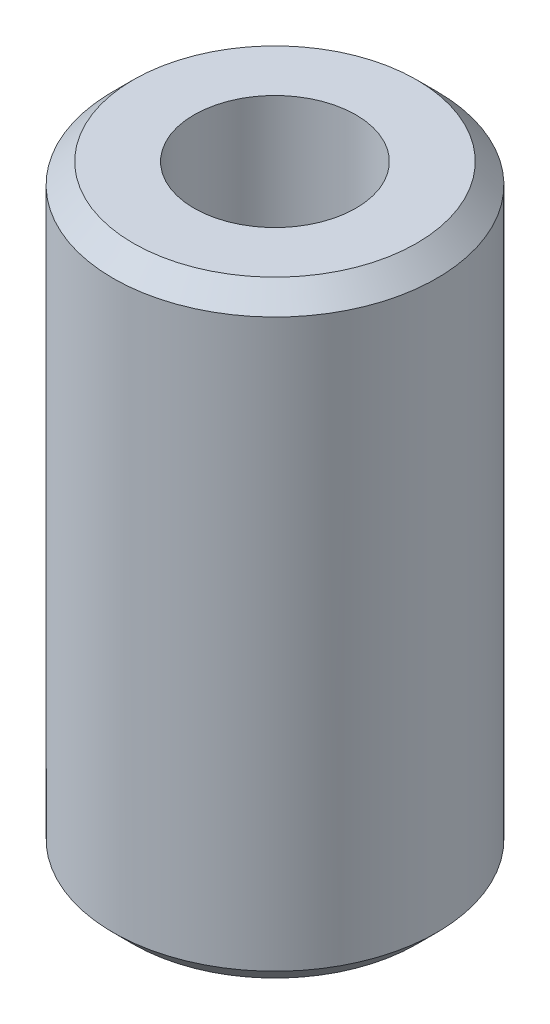
ISO-10303-21;
HEADER;
FILE_DESCRIPTION(('STEP AP214'),'2;1');
FILE_NAME('part.step','',(''),(''),'','','');
FILE_SCHEMA(('AUTOMOTIVE_DESIGN { 1 0 10303 214 1 1 1 1 }'));
ENDSEC;
DATA;
#1=APPLICATION_CONTEXT('core data for automotive mechanical design processes');
#2=APPLICATION_PROTOCOL_DEFINITION('international standard','automotive_design',2000,#1);
#3=PRODUCT_CONTEXT('',#1,'mechanical');
#4=PRODUCT('Part','Part','',(#3));
#5=PRODUCT_RELATED_PRODUCT_CATEGORY('part','',(#4));
#6=PRODUCT_DEFINITION_FORMATION('','',#4);
#7=PRODUCT_DEFINITION_CONTEXT('part definition',#1,'design');
#8=PRODUCT_DEFINITION('design','',#6,#7);
#9=PRODUCT_DEFINITION_SHAPE('','',#8);
#10=(LENGTH_UNIT() NAMED_UNIT(*) SI_UNIT(.MILLI.,.METRE.));
#11=(NAMED_UNIT(*) PLANE_ANGLE_UNIT() SI_UNIT($,.RADIAN.));
#12=(NAMED_UNIT(*) SI_UNIT($,.STERADIAN.) SOLID_ANGLE_UNIT());
#13=UNCERTAINTY_MEASURE_WITH_UNIT(LENGTH_MEASURE(1.E-05),#10,'distance_accuracy_value','');
#14=(GEOMETRIC_REPRESENTATION_CONTEXT(3) GLOBAL_UNCERTAINTY_ASSIGNED_CONTEXT((#13)) GLOBAL_UNIT_ASSIGNED_CONTEXT((#10,
#11,#12)) REPRESENTATION_CONTEXT('',''));
#15=CARTESIAN_POINT('',(0.,0.,0.));
#16=DIRECTION('',(0.,0.,1.));
#17=DIRECTION('',(1.,0.,0.));
#18=AXIS2_PLACEMENT_3D('',#15,#16,#17);
#19=CARTESIAN_POINT('',(8.,0.,0.));
#20=DIRECTION('',(0.,-1.,0.));
#21=DIRECTION('',(0.,0.,-1.));
#22=AXIS2_PLACEMENT_3D('',#19,#20,#21);
#23=PLANE('',#22);
#24=CARTESIAN_POINT('',(0.,0.,0.));
#25=DIRECTION('',(0.,-1.,0.));
#26=DIRECTION('',(0.,0.,-1.));
#27=AXIS2_PLACEMENT_3D('',#24,#25,#26);
#28=CIRCLE('',#27,7.);
#29=CARTESIAN_POINT('',(0.,0.,-7.));
#30=VERTEX_POINT('',#29);
#31=EDGE_CURVE('E10',#30,#30,#28,.T.);
#32=ORIENTED_EDGE('',*,*,#31,.T.);
#33=EDGE_LOOP('',(#32));
#34=FACE_BOUND('',#33,.T.);
#35=CARTESIAN_POINT('',(0.,0.,0.));
#36=DIRECTION('',(0.,-1.,0.));
#37=DIRECTION('',(0.,0.,-1.));
#38=AXIS2_PLACEMENT_3D('',#35,#36,#37);
#39=CIRCLE('',#38,4.);
#40=CARTESIAN_POINT('',(0.,0.,-4.));
#41=VERTEX_POINT('',#40);
#42=EDGE_CURVE('E61',#41,#41,#39,.T.);
#43=ORIENTED_EDGE('',*,*,#42,.F.);
#44=EDGE_LOOP('',(#43));
#45=FACE_BOUND('',#44,.T.);
#46=ADVANCED_FACE('F41',(#34,#45),#23,.T.);
#47=CARTESIAN_POINT('',(0.,0.,0.));
#48=DIRECTION('',(0.,-1.,0.));
#49=DIRECTION('',(0.,0.,-1.));
#50=AXIS2_PLACEMENT_3D('',#47,#48,#49);
#51=CYLINDRICAL_SURFACE('',#50,4.);
#52=ORIENTED_EDGE('',*,*,#42,.T.);
#53=EDGE_LOOP('',(#52));
#54=FACE_BOUND('',#53,.T.);
#55=CARTESIAN_POINT('',(0.,10.,0.));
#56=DIRECTION('',(0.,-1.,0.));
#57=DIRECTION('',(0.,0.,-1.));
#58=AXIS2_PLACEMENT_3D('',#55,#56,#57);
#59=CIRCLE('',#58,4.);
#60=CARTESIAN_POINT('',(0.,10.,-4.));
#61=VERTEX_POINT('',#60);
#62=EDGE_CURVE('E64',#61,#61,#59,.T.);
#63=ORIENTED_EDGE('',*,*,#62,.F.);
#64=EDGE_LOOP('',(#63));
#65=FACE_BOUND('',#64,.T.);
#66=ADVANCED_FACE('F97',(#54,#65),#51,.F.);
#67=CARTESIAN_POINT('',(0.,13.,0.));
#68=DIRECTION('',(0.,-1.,0.));
#69=DIRECTION('',(0.,0.,-1.));
#70=AXIS2_PLACEMENT_3D('',#67,#68,#69);
#71=CONICAL_SURFACE('',#70,1.,0.785398163397446);
#72=CARTESIAN_POINT('',(0.,13.,0.));
#73=DIRECTION('',(0.,-1.,0.));
#74=DIRECTION('',(0.,0.,-1.));
#75=AXIS2_PLACEMENT_3D('',#72,#73,#74);
#76=CIRCLE('',#75,1.);
#77=CARTESIAN_POINT('',(0.,13.,-0.999999999999999));
#78=VERTEX_POINT('',#77);
#79=EDGE_CURVE('E67',#78,#78,#76,.T.);
#80=CARTESIAN_POINT('',(0.,10.,-4.));
#81=CARTESIAN_POINT('',(0.,10.03125,-3.96875));
#82=CARTESIAN_POINT('',(0.,10.0625,-3.9375));
#83=CARTESIAN_POINT('',(0.,10.125,-3.875));
#84=CARTESIAN_POINT('',(0.,10.15625,-3.84375));
#85=CARTESIAN_POINT('',(0.,10.21875,-3.78125));
#86=CARTESIAN_POINT('',(0.,10.25,-3.75));
#87=CARTESIAN_POINT('',(0.,10.3125,-3.6875));
#88=CARTESIAN_POINT('',(0.,10.34375,-3.65625));
#89=CARTESIAN_POINT('',(0.,10.40625,-3.59375));
#90=CARTESIAN_POINT('',(0.,10.4375,-3.5625));
#91=CARTESIAN_POINT('',(0.,10.5,-3.5));
#92=CARTESIAN_POINT('',(0.,10.53125,-3.46875));
#93=CARTESIAN_POINT('',(0.,10.59375,-3.40625));
#94=CARTESIAN_POINT('',(0.,10.625,-3.375));
#95=CARTESIAN_POINT('',(0.,10.6875,-3.3125));
#96=CARTESIAN_POINT('',(0.,10.71875,-3.28125));
#97=CARTESIAN_POINT('',(0.,10.78125,-3.21875));
#98=CARTESIAN_POINT('',(0.,10.8125,-3.1875));
#99=CARTESIAN_POINT('',(0.,10.875,-3.125));
#100=CARTESIAN_POINT('',(0.,10.90625,-3.09375));
#101=CARTESIAN_POINT('',(0.,10.96875,-3.03125));
#102=CARTESIAN_POINT('',(0.,11.,-3.));
#103=CARTESIAN_POINT('',(0.,11.0625,-2.9375));
#104=CARTESIAN_POINT('',(0.,11.09375,-2.90625));
#105=CARTESIAN_POINT('',(0.,11.15625,-2.84375));
#106=CARTESIAN_POINT('',(0.,11.1875,-2.8125));
#107=CARTESIAN_POINT('',(0.,11.25,-2.75));
#108=CARTESIAN_POINT('',(0.,11.28125,-2.71875));
#109=CARTESIAN_POINT('',(0.,11.34375,-2.65625));
#110=CARTESIAN_POINT('',(0.,11.375,-2.625));
#111=CARTESIAN_POINT('',(0.,11.4375,-2.5625));
#112=CARTESIAN_POINT('',(0.,11.46875,-2.53125));
#113=CARTESIAN_POINT('',(0.,11.53125,-2.46875));
#114=CARTESIAN_POINT('',(0.,11.5625,-2.4375));
#115=CARTESIAN_POINT('',(0.,11.625,-2.375));
#116=CARTESIAN_POINT('',(0.,11.65625,-2.34375));
#117=CARTESIAN_POINT('',(0.,11.71875,-2.28125));
#118=CARTESIAN_POINT('',(0.,11.75,-2.25));
#119=CARTESIAN_POINT('',(0.,11.8125,-2.1875));
#120=CARTESIAN_POINT('',(0.,11.84375,-2.15625));
#121=CARTESIAN_POINT('',(0.,11.90625,-2.09375));
#122=CARTESIAN_POINT('',(0.,11.9375,-2.0625));
#123=CARTESIAN_POINT('',(0.,12.,-2.));
#124=CARTESIAN_POINT('',(0.,12.03125,-1.96875));
#125=CARTESIAN_POINT('',(0.,12.09375,-1.90625));
#126=CARTESIAN_POINT('',(0.,12.125,-1.875));
#127=CARTESIAN_POINT('',(0.,12.1875,-1.8125));
#128=CARTESIAN_POINT('',(0.,12.21875,-1.78125));
#129=CARTESIAN_POINT('',(0.,12.28125,-1.71875));
#130=CARTESIAN_POINT('',(0.,12.3125,-1.6875));
#131=CARTESIAN_POINT('',(0.,12.375,-1.625));
#132=CARTESIAN_POINT('',(0.,12.40625,-1.59375));
#133=CARTESIAN_POINT('',(0.,12.46875,-1.53125));
#134=CARTESIAN_POINT('',(0.,12.5,-1.5));
#135=CARTESIAN_POINT('',(0.,12.5625,-1.4375));
#136=CARTESIAN_POINT('',(0.,12.59375,-1.40625));
#137=CARTESIAN_POINT('',(0.,12.65625,-1.34375));
#138=CARTESIAN_POINT('',(0.,12.6875,-1.3125));
#139=CARTESIAN_POINT('',(0.,12.75,-1.25));
#140=CARTESIAN_POINT('',(0.,12.78125,-1.21875));
#141=CARTESIAN_POINT('',(0.,12.84375,-1.15625));
#142=CARTESIAN_POINT('',(0.,12.875,-1.125));
#143=CARTESIAN_POINT('',(0.,12.9375,-1.0625));
#144=CARTESIAN_POINT('',(0.,12.96875,-1.03125));
#145=CARTESIAN_POINT('',(0.,13.,-0.999999999999999));
#146=B_SPLINE_CURVE_WITH_KNOTS('',3,(#80,#81,#82,#83,#84,#85,#86,#87,#88,#89,#90,#91,#92,#93,
#94,#95,#96,#97,#98,#99,#100,#101,#102,#103,#104,#105,#106,#107,#108,#109,#110,#111,#112,#113,
#114,#115,#116,#117,#118,#119,#120,#121,#122,#123,#124,#125,#126,#127,#128,#129,#130,#131,#132,
#133,#134,#135,#136,#137,#138,#139,#140,#141,#142,#143,#144,#145),.UNSPECIFIED.,.F.,.F.,(4,2,2,
2,2,2,2,2,2,2,2,2,2,2,2,2,2,2,2,2,2,2,2,2,2,2,2,2,2,2,2,2,4),(0.,0.132582521472477,
0.265165042944955,0.397747564417433,0.53033008588991,0.662912607362388,0.795495128834866,
0.928077650307344,1.06066017177982,1.1932426932523,1.32582521472478,1.45840773619726,
1.59099025766973,1.72357277914221,1.85615530061469,1.98873782208717,2.12132034355965,
2.25390286503212,2.3864853865046,2.51906790797708,2.65165042944956,2.78423295092203,
2.91681547239451,3.04939799386699,3.18198051533947,3.31456303681195,3.44714555828442,
3.5797280797569,3.71231060122938,3.84489312270186,3.97747564417434,4.11005816564681,
4.24264068711929),.UNSPECIFIED.);
#147=EDGE_CURVE('BSEAM102',#61,#78,#146,.T.);
#148=ORIENTED_EDGE('',*,*,#62,.T.);
#149=ORIENTED_EDGE('',*,*,#79,.F.);
#150=ORIENTED_EDGE('',*,*,#147,.T.);
#151=ORIENTED_EDGE('',*,*,#147,.F.);
#152=EDGE_LOOP('',(#148,#150,#149,#151));
#153=FACE_BOUND('',#152,.T.);
#154=ADVANCED_FACE('F102',(#153),#71,.F.);
#155=CARTESIAN_POINT('',(0.,0.,0.));
#156=DIRECTION('',(0.,-1.,0.));
#157=DIRECTION('',(0.,0.,-1.));
#158=AXIS2_PLACEMENT_3D('',#155,#156,#157);
#159=CYLINDRICAL_SURFACE('',#158,1.);
#160=ORIENTED_EDGE('',*,*,#79,.T.);
#161=EDGE_LOOP('',(#160));
#162=FACE_BOUND('',#161,.T.);
#163=CARTESIAN_POINT('',(0.,17.,0.));
#164=DIRECTION('',(0.,-1.,0.));
#165=DIRECTION('',(0.,0.,-1.));
#166=AXIS2_PLACEMENT_3D('',#163,#164,#165);
#167=CIRCLE('',#166,1.);
#168=CARTESIAN_POINT('',(0.,17.,1.));
#169=VERTEX_POINT('',#168);
#170=EDGE_CURVE('E70',#169,#169,#167,.T.);
#171=ORIENTED_EDGE('',*,*,#170,.F.);
#172=EDGE_LOOP('',(#171));
#173=FACE_BOUND('',#172,.T.);
#174=ADVANCED_FACE('F93',(#162,#173),#159,.F.);
#175=CARTESIAN_POINT('',(0.,20.,0.));
#176=DIRECTION('',(0.,1.,0.));
#177=DIRECTION('',(0.,0.,1.));
#178=AXIS2_PLACEMENT_3D('',#175,#176,#177);
#179=CONICAL_SURFACE('',#178,4.00000000000001,0.78539816339745);
#180=CARTESIAN_POINT('',(0.,20.,0.));
#181=DIRECTION('',(0.,-1.,0.));
#182=DIRECTION('',(0.,0.,-1.));
#183=AXIS2_PLACEMENT_3D('',#180,#181,#182);
#184=CIRCLE('',#183,4.00000000000001);
#185=CARTESIAN_POINT('',(0.,20.,4.00000000000001));
#186=VERTEX_POINT('',#185);
#187=EDGE_CURVE('E73',#186,#186,#184,.T.);
#188=CARTESIAN_POINT('',(0.,17.,1.));
#189=CARTESIAN_POINT('',(0.,17.03125,1.03125));
#190=CARTESIAN_POINT('',(0.,17.0625,1.0625));
#191=CARTESIAN_POINT('',(0.,17.125,1.125));
#192=CARTESIAN_POINT('',(0.,17.15625,1.15625));
#193=CARTESIAN_POINT('',(0.,17.21875,1.21875));
#194=CARTESIAN_POINT('',(0.,17.25,1.25));
#195=CARTESIAN_POINT('',(0.,17.3125,1.3125));
#196=CARTESIAN_POINT('',(0.,17.34375,1.34375));
#197=CARTESIAN_POINT('',(0.,17.40625,1.40625));
#198=CARTESIAN_POINT('',(0.,17.4375,1.4375));
#199=CARTESIAN_POINT('',(0.,17.5,1.5));
#200=CARTESIAN_POINT('',(0.,17.53125,1.53125));
#201=CARTESIAN_POINT('',(0.,17.59375,1.59375));
#202=CARTESIAN_POINT('',(0.,17.625,1.625));
#203=CARTESIAN_POINT('',(0.,17.6875,1.6875));
#204=CARTESIAN_POINT('',(0.,17.71875,1.71875));
#205=CARTESIAN_POINT('',(0.,17.78125,1.78125));
#206=CARTESIAN_POINT('',(0.,17.8125,1.8125));
#207=CARTESIAN_POINT('',(0.,17.875,1.875));
#208=CARTESIAN_POINT('',(0.,17.90625,1.90625));
#209=CARTESIAN_POINT('',(0.,17.96875,1.96875));
#210=CARTESIAN_POINT('',(0.,18.,2.));
#211=CARTESIAN_POINT('',(0.,18.0625,2.0625));
#212=CARTESIAN_POINT('',(0.,18.09375,2.09375));
#213=CARTESIAN_POINT('',(0.,18.15625,2.15625));
#214=CARTESIAN_POINT('',(0.,18.1875,2.1875));
#215=CARTESIAN_POINT('',(0.,18.25,2.25));
#216=CARTESIAN_POINT('',(0.,18.28125,2.28125));
#217=CARTESIAN_POINT('',(0.,18.34375,2.34375));
#218=CARTESIAN_POINT('',(0.,18.375,2.37500000000001));
#219=CARTESIAN_POINT('',(0.,18.4375,2.43750000000001));
#220=CARTESIAN_POINT('',(0.,18.46875,2.46875000000001));
#221=CARTESIAN_POINT('',(0.,18.53125,2.53125000000001));
#222=CARTESIAN_POINT('',(0.,18.5625,2.56250000000001));
#223=CARTESIAN_POINT('',(0.,18.625,2.62500000000001));
#224=CARTESIAN_POINT('',(0.,18.65625,2.65625000000001));
#225=CARTESIAN_POINT('',(0.,18.71875,2.71875000000001));
#226=CARTESIAN_POINT('',(0.,18.75,2.75000000000001));
#227=CARTESIAN_POINT('',(0.,18.8125,2.81250000000001));
#228=CARTESIAN_POINT('',(0.,18.84375,2.84375000000001));
#229=CARTESIAN_POINT('',(0.,18.90625,2.90625000000001));
#230=CARTESIAN_POINT('',(0.,18.9375,2.93750000000001));
#231=CARTESIAN_POINT('',(0.,19.,3.00000000000001));
#232=CARTESIAN_POINT('',(0.,19.03125,3.03125000000001));
#233=CARTESIAN_POINT('',(0.,19.09375,3.09375000000001));
#234=CARTESIAN_POINT('',(0.,19.125,3.12500000000001));
#235=CARTESIAN_POINT('',(0.,19.1875,3.18750000000001));
#236=CARTESIAN_POINT('',(0.,19.21875,3.21875000000001));
#237=CARTESIAN_POINT('',(0.,19.28125,3.28125000000001));
#238=CARTESIAN_POINT('',(0.,19.3125,3.31250000000001));
#239=CARTESIAN_POINT('',(0.,19.375,3.37500000000001));
#240=CARTESIAN_POINT('',(0.,19.40625,3.40625000000001));
#241=CARTESIAN_POINT('',(0.,19.46875,3.46875000000001));
#242=CARTESIAN_POINT('',(0.,19.5,3.50000000000001));
#243=CARTESIAN_POINT('',(0.,19.5625,3.56250000000001));
#244=CARTESIAN_POINT('',(0.,19.59375,3.59375000000001));
#245=CARTESIAN_POINT('',(0.,19.65625,3.65625000000001));
#246=CARTESIAN_POINT('',(0.,19.6875,3.68750000000001));
#247=CARTESIAN_POINT('',(0.,19.75,3.75000000000001));
#248=CARTESIAN_POINT('',(0.,19.78125,3.78125000000001));
#249=CARTESIAN_POINT('',(0.,19.84375,3.84375000000001));
#250=CARTESIAN_POINT('',(0.,19.875,3.87500000000001));
#251=CARTESIAN_POINT('',(0.,19.9375,3.93750000000001));
#252=CARTESIAN_POINT('',(0.,19.96875,3.96875000000001));
#253=CARTESIAN_POINT('',(0.,20.,4.00000000000001));
#254=B_SPLINE_CURVE_WITH_KNOTS('',3,(#188,#189,#190,#191,#192,#193,#194,#195,#196,#197,#198,
#199,#200,#201,#202,#203,#204,#205,#206,#207,#208,#209,#210,#211,#212,#213,#214,#215,#216,#217,
#218,#219,#220,#221,#222,#223,#224,#225,#226,#227,#228,#229,#230,#231,#232,#233,#234,#235,#236,
#237,#238,#239,#240,#241,#242,#243,#244,#245,#246,#247,#248,#249,#250,#251,#252,#253),
.UNSPECIFIED.,.F.,.F.,(4,2,2,2,2,2,2,2,2,2,2,2,2,2,2,2,2,2,2,2,2,2,2,2,2,2,2,2,2,2,2,2,4),(0.,
0.132582521472481,0.265165042944956,0.397747564417434,0.530330085889911,0.66291260736239,
0.795495128834867,0.928077650307345,1.06066017177982,1.1932426932523,1.32582521472478,
1.45840773619726,1.59099025766974,1.72357277914221,1.85615530061469,1.98873782208717,
2.12132034355965,2.25390286503212,2.3864853865046,2.51906790797708,2.65165042944956,
2.78423295092203,2.91681547239451,3.04939799386699,3.18198051533947,3.31456303681194,
3.44714555828442,3.5797280797569,3.71231060122938,3.84489312270186,3.97747564417433,
4.11005816564681,4.24264068711929),.UNSPECIFIED.);
#255=EDGE_CURVE('BSEAM84',#169,#186,#254,.T.);
#256=ORIENTED_EDGE('',*,*,#170,.T.);
#257=ORIENTED_EDGE('',*,*,#187,.F.);
#258=ORIENTED_EDGE('',*,*,#255,.T.);
#259=ORIENTED_EDGE('',*,*,#255,.F.);
#260=EDGE_LOOP('',(#256,#258,#257,#259));
#261=FACE_BOUND('',#260,.T.);
#262=ADVANCED_FACE('F84',(#261),#179,.F.);
#263=CARTESIAN_POINT('',(0.,0.,0.));
#264=DIRECTION('',(0.,-1.,0.));
#265=DIRECTION('',(0.,0.,-1.));
#266=AXIS2_PLACEMENT_3D('',#263,#264,#265);
#267=CYLINDRICAL_SURFACE('',#266,4.00000000000001);
#268=ORIENTED_EDGE('',*,*,#187,.T.);
#269=EDGE_LOOP('',(#268));
#270=FACE_BOUND('',#269,.T.);
#271=CARTESIAN_POINT('',(0.,30.,0.));
#272=DIRECTION('',(0.,-1.,0.));
#273=DIRECTION('',(0.,0.,-1.));
#274=AXIS2_PLACEMENT_3D('',#271,#272,#273);
#275=CIRCLE('',#274,4.00000000000001);
#276=CARTESIAN_POINT('',(0.,30.,-4.00000000000001));
#277=VERTEX_POINT('',#276);
#278=EDGE_CURVE('E76',#277,#277,#275,.T.);
#279=ORIENTED_EDGE('',*,*,#278,.F.);
#280=EDGE_LOOP('',(#279));
#281=FACE_BOUND('',#280,.T.);
#282=ADVANCED_FACE('F82',(#270,#281),#267,.F.);
#283=CARTESIAN_POINT('',(4.00000000000001,30.,0.));
#284=DIRECTION('',(0.,1.,0.));
#285=DIRECTION('',(0.,0.,1.));
#286=AXIS2_PLACEMENT_3D('',#283,#284,#285);
#287=PLANE('',#286);
#288=CARTESIAN_POINT('',(0.,30.,0.));
#289=DIRECTION('',(0.,1.,0.));
#290=DIRECTION('',(0.,0.,1.));
#291=AXIS2_PLACEMENT_3D('',#288,#289,#290);
#292=CIRCLE('',#291,7.);
#293=CARTESIAN_POINT('',(0.,30.,7.));
#294=VERTEX_POINT('',#293);
#295=EDGE_CURVE('E48',#294,#294,#292,.T.);
#296=ORIENTED_EDGE('',*,*,#295,.T.);
#297=EDGE_LOOP('',(#296));
#298=FACE_BOUND('',#297,.T.);
#299=ORIENTED_EDGE('',*,*,#278,.T.);
#300=EDGE_LOOP('',(#299));
#301=FACE_BOUND('',#300,.T.);
#302=ADVANCED_FACE('F80',(#298,#301),#287,.T.);
#303=CARTESIAN_POINT('',(0.,0.,0.));
#304=DIRECTION('',(0.,-1.,0.));
#305=DIRECTION('',(0.,0.,-1.));
#306=AXIS2_PLACEMENT_3D('',#303,#304,#305);
#307=CYLINDRICAL_SURFACE('',#306,8.);
#308=CARTESIAN_POINT('',(0.,29.,0.));
#309=DIRECTION('',(0.,1.,0.));
#310=DIRECTION('',(0.,0.,1.));
#311=AXIS2_PLACEMENT_3D('',#308,#309,#310);
#312=CIRCLE('',#311,8.);
#313=CARTESIAN_POINT('',(0.,29.,8.));
#314=VERTEX_POINT('',#313);
#315=EDGE_CURVE('E52',#314,#314,#312,.F.);
#316=ORIENTED_EDGE('',*,*,#315,.T.);
#317=EDGE_LOOP('',(#316));
#318=FACE_BOUND('',#317,.T.);
#319=CARTESIAN_POINT('',(0.,1.00000000000001,0.));
#320=DIRECTION('',(0.,-1.,0.));
#321=DIRECTION('',(0.,0.,-1.));
#322=AXIS2_PLACEMENT_3D('',#319,#320,#321);
#323=CIRCLE('',#322,8.);
#324=CARTESIAN_POINT('',(0.,1.00000000000001,-8.));
#325=VERTEX_POINT('',#324);
#326=EDGE_CURVE('E56',#325,#325,#323,.F.);
#327=ORIENTED_EDGE('',*,*,#326,.T.);
#328=EDGE_LOOP('',(#327));
#329=FACE_BOUND('',#328,.T.);
#330=ADVANCED_FACE('F91',(#318,#329),#307,.T.);
#331=CARTESIAN_POINT('',(0.,29.,0.));
#332=DIRECTION('',(0.,-1.,0.));
#333=DIRECTION('',(0.,0.,-1.));
#334=AXIS2_PLACEMENT_3D('',#331,#332,#333);
#335=CONICAL_SURFACE('',#334,8.,0.785398163397447);
#336=ORIENTED_EDGE('',*,*,#295,.F.);
#337=EDGE_LOOP('',(#336));
#338=FACE_BOUND('',#337,.T.);
#339=ORIENTED_EDGE('',*,*,#315,.F.);
#340=EDGE_LOOP('',(#339));
#341=FACE_BOUND('',#340,.T.);
#342=ADVANCED_FACE('F107',(#338,#341),#335,.T.);
#343=CARTESIAN_POINT('',(0.,0.,0.));
#344=DIRECTION('',(0.,1.,0.));
#345=DIRECTION('',(0.,0.,1.));
#346=AXIS2_PLACEMENT_3D('',#343,#344,#345);
#347=CONICAL_SURFACE('',#346,7.,0.785398163397444);
#348=ORIENTED_EDGE('',*,*,#326,.F.);
#349=EDGE_LOOP('',(#348));
#350=FACE_BOUND('',#349,.T.);
#351=ORIENTED_EDGE('',*,*,#31,.F.);
#352=EDGE_LOOP('',(#351));
#353=FACE_BOUND('',#352,.T.);
#354=ADVANCED_FACE('F43',(#350,#353),#347,.T.);
#355=CLOSED_SHELL('',(#46,#66,#154,#174,#262,#282,#302,#330,#342,#354));
#356=MANIFOLD_SOLID_BREP('B2',#355);
#357=ADVANCED_BREP_SHAPE_REPRESENTATION('',(#18,#356),#14);
#358=SHAPE_DEFINITION_REPRESENTATION(#9,#357);
ENDSEC;
END-ISO-10303-21;
